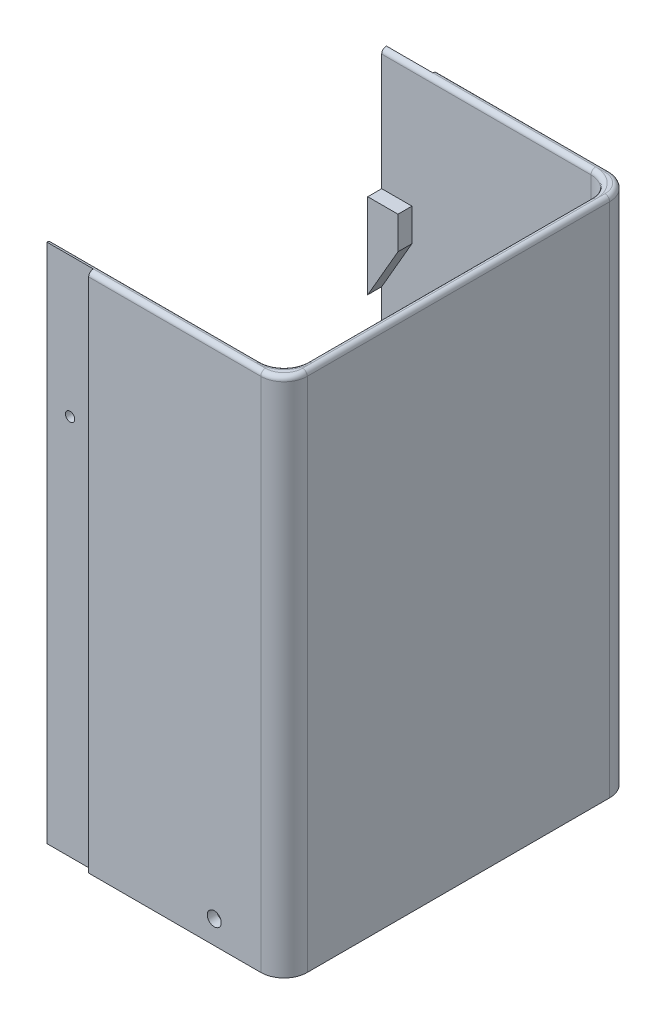
ISO-10303-21;
HEADER;
FILE_DESCRIPTION(('STEP AP214'),'2;1');
FILE_NAME('part.step','',(''),(''),'','','');
FILE_SCHEMA(('AUTOMOTIVE_DESIGN { 1 0 10303 214 1 1 1 1 }'));
ENDSEC;
DATA;
#1=APPLICATION_CONTEXT('core data for automotive mechanical design processes');
#2=APPLICATION_PROTOCOL_DEFINITION('international standard','automotive_design',2000,#1);
#3=PRODUCT_CONTEXT('',#1,'mechanical');
#4=PRODUCT('Part','Part','',(#3));
#5=PRODUCT_RELATED_PRODUCT_CATEGORY('part','',(#4));
#6=PRODUCT_DEFINITION_FORMATION('','',#4);
#7=PRODUCT_DEFINITION_CONTEXT('part definition',#1,'design');
#8=PRODUCT_DEFINITION('design','',#6,#7);
#9=PRODUCT_DEFINITION_SHAPE('','',#8);
#10=(LENGTH_UNIT() NAMED_UNIT(*) SI_UNIT(.MILLI.,.METRE.));
#11=(NAMED_UNIT(*) PLANE_ANGLE_UNIT() SI_UNIT($,.RADIAN.));
#12=(NAMED_UNIT(*) SI_UNIT($,.STERADIAN.) SOLID_ANGLE_UNIT());
#13=UNCERTAINTY_MEASURE_WITH_UNIT(LENGTH_MEASURE(1.E-05),#10,'distance_accuracy_value','');
#14=(GEOMETRIC_REPRESENTATION_CONTEXT(3) GLOBAL_UNCERTAINTY_ASSIGNED_CONTEXT((#13)) GLOBAL_UNIT_ASSIGNED_CONTEXT((#10,
#11,#12)) REPRESENTATION_CONTEXT('',''));
#15=CARTESIAN_POINT('',(0.,0.,0.));
#16=DIRECTION('',(0.,0.,1.));
#17=DIRECTION('',(1.,0.,0.));
#18=AXIS2_PLACEMENT_3D('',#15,#16,#17);
#19=CARTESIAN_POINT('',(-52.,12.,-35.5));
#20=DIRECTION('',(0.,0.,1.));
#21=DIRECTION('',(1.,0.,0.));
#22=AXIS2_PLACEMENT_3D('',#19,#20,#21);
#23=PLANE('',#22);
#24=CARTESIAN_POINT('',(37.,5.,-35.5));
#25=DIRECTION('',(0.,0.,1.));
#26=DIRECTION('',(1.,0.,0.));
#27=AXIS2_PLACEMENT_3D('',#24,#25,#26);
#28=CIRCLE('',#27,1.5);
#29=CARTESIAN_POINT('',(38.5,5.,-35.5));
#30=VERTEX_POINT('',#29);
#31=EDGE_CURVE('E380',#30,#30,#28,.T.);
#32=ORIENTED_EDGE('',*,*,#31,.F.);
#33=EDGE_LOOP('',(#32));
#34=FACE_BOUND('',#33,.T.);
#35=DIRECTION('',(0.,1.,0.));
#36=VECTOR('',#35,1.);
#37=CARTESIAN_POINT('',(6.49999999999999,85.937822173508,-35.5));
#38=LINE('',#37,#36);
#39=CARTESIAN_POINT('',(6.5,78.937822173508,-35.5));
#40=VERTEX_POINT('',#39);
#41=CARTESIAN_POINT('',(6.49999999999999,85.937822173508,-35.5));
#42=VERTEX_POINT('',#41);
#43=EDGE_CURVE('E306',#40,#42,#38,.T.);
#44=ORIENTED_EDGE('',*,*,#43,.F.);
#45=DIRECTION('',(0.500000000000025,0.866025403784424,0.));
#46=VECTOR('',#45,1.);
#47=CARTESIAN_POINT('',(6.5,78.937822173508,-35.5));
#48=LINE('',#47,#46);
#49=CARTESIAN_POINT('',(0.,67.679491924311,-35.5));
#50=VERTEX_POINT('',#49);
#51=EDGE_CURVE('E286',#50,#40,#48,.T.);
#52=ORIENTED_EDGE('',*,*,#51,.F.);
#53=DIRECTION('',(0.,1.,0.));
#54=VECTOR('',#53,1.);
#55=CARTESIAN_POINT('',(0.,112.,-35.5));
#56=LINE('',#55,#54);
#57=CARTESIAN_POINT('',(0.,0.,-35.5));
#58=VERTEX_POINT('',#57);
#59=EDGE_CURVE('E356',#58,#50,#56,.T.);
#60=ORIENTED_EDGE('',*,*,#59,.F.);
#61=DIRECTION('',(-1.,0.,0.));
#62=VECTOR('',#61,1.);
#63=CARTESIAN_POINT('',(-52.,0.,-35.5));
#64=LINE('',#63,#62);
#65=CARTESIAN_POINT('',(45.,0.,-35.5));
#66=VERTEX_POINT('',#65);
#67=EDGE_CURVE('E388',#66,#58,#64,.T.);
#68=ORIENTED_EDGE('',*,*,#67,.F.);
#69=DIRECTION('',(0.,-1.,0.));
#70=VECTOR('',#69,1.);
#71=CARTESIAN_POINT('',(44.9999999999999,112.,-35.5));
#72=LINE('',#71,#70);
#73=CARTESIAN_POINT('',(44.9999999999999,111.,-35.5));
#74=VERTEX_POINT('',#73);
#75=EDGE_CURVE('E429',#66,#74,#72,.F.);
#76=ORIENTED_EDGE('',*,*,#75,.T.);
#77=DIRECTION('',(1.,0.,0.));
#78=VECTOR('',#77,1.);
#79=CARTESIAN_POINT('',(-52.0000000000001,111.,-35.5));
#80=LINE('',#79,#78);
#81=CARTESIAN_POINT('',(0.,111.,-35.5));
#82=VERTEX_POINT('',#81);
#83=EDGE_CURVE('E488',#74,#82,#80,.F.);
#84=ORIENTED_EDGE('',*,*,#83,.T.);
#85=CARTESIAN_POINT('',(0.,85.937822173508,-35.5));
#86=VERTEX_POINT('',#85);
#87=EDGE_CURVE('E355',#86,#82,#56,.T.);
#88=ORIENTED_EDGE('',*,*,#87,.F.);
#89=DIRECTION('',(-1.,0.,0.));
#90=VECTOR('',#89,1.);
#91=CARTESIAN_POINT('',(0.,85.937822173508,-35.5));
#92=LINE('',#91,#90);
#93=EDGE_CURVE('E295',#42,#86,#92,.T.);
#94=ORIENTED_EDGE('',*,*,#93,.F.);
#95=EDGE_LOOP('',(#44,#52,#60,#68,#76,#84,#88,#94));
#96=FACE_BOUND('',#95,.T.);
#97=ADVANCED_FACE('F41',(#34,#96),#23,.T.);
#98=CARTESIAN_POINT('',(52.,112.,-37.5));
#99=DIRECTION('',(0.,1.,0.));
#100=DIRECTION('',(-1.,0.,0.));
#101=AXIS2_PLACEMENT_3D('',#98,#99,#100);
#102=PLANE('',#101);
#103=DIRECTION('',(0.,0.,1.));
#104=VECTOR('',#103,1.);
#105=CARTESIAN_POINT('',(50.9999999999999,112.,-32.5));
#106=LINE('',#105,#104);
#107=CARTESIAN_POINT('',(51.,112.,32.5));
#108=VERTEX_POINT('',#107);
#109=CARTESIAN_POINT('',(51.,112.,30.5));
#110=VERTEX_POINT('',#109);
#111=EDGE_CURVE('E475',#108,#110,#106,.F.);
#112=ORIENTED_EDGE('',*,*,#111,.T.);
#113=CARTESIAN_POINT('',(44.9999999999999,112.,30.5));
#114=DIRECTION('',(0.,1.,0.));
#115=DIRECTION('',(-1.,0.,0.));
#116=AXIS2_PLACEMENT_3D('',#113,#114,#115);
#117=CIRCLE('',#116,6.);
#118=CARTESIAN_POINT('',(44.9999999999999,112.,36.5));
#119=VERTEX_POINT('',#118);
#120=EDGE_CURVE('E484',#110,#119,#117,.F.);
#121=ORIENTED_EDGE('',*,*,#120,.T.);
#122=DIRECTION('',(-1.,0.,0.));
#123=VECTOR('',#122,1.);
#124=CARTESIAN_POINT('',(47.,112.,36.5));
#125=LINE('',#124,#123);
#126=CARTESIAN_POINT('',(47.,112.,36.5));
#127=VERTEX_POINT('',#126);
#128=EDGE_CURVE('E481',#119,#127,#125,.F.);
#129=ORIENTED_EDGE('',*,*,#128,.T.);
#130=CARTESIAN_POINT('',(47.,112.,32.5));
#131=DIRECTION('',(0.,1.,0.));
#132=DIRECTION('',(-1.,0.,0.));
#133=AXIS2_PLACEMENT_3D('',#130,#131,#132);
#134=CIRCLE('',#133,4.);
#135=EDGE_CURVE('E478',#127,#108,#134,.T.);
#136=ORIENTED_EDGE('',*,*,#135,.T.);
#137=EDGE_LOOP('',(#112,#121,#129,#136));
#138=FACE_BOUND('',#137,.T.);
#139=ADVANCED_FACE('F622',(#138),#102,.T.);
#140=CARTESIAN_POINT('',(10.,0.,0.));
#141=DIRECTION('',(1.,0.,0.));
#142=DIRECTION('',(0.,0.,-1.));
#143=AXIS2_PLACEMENT_3D('',#140,#141,#142);
#144=PLANE('',#143);
#145=DIRECTION('',(0.,-1.,0.));
#146=VECTOR('',#145,1.);
#147=CARTESIAN_POINT('',(10.,12.,37.5));
#148=LINE('',#147,#146);
#149=CARTESIAN_POINT('',(10.,111.,37.5));
#150=VERTEX_POINT('',#149);
#151=CARTESIAN_POINT('',(10.,0.,37.5));
#152=VERTEX_POINT('',#151);
#153=EDGE_CURVE('E415',#150,#152,#148,.T.);
#154=ORIENTED_EDGE('',*,*,#153,.F.);
#155=CARTESIAN_POINT('',(10.,111.,36.5));
#156=DIRECTION('',(1.,0.,0.));
#157=DIRECTION('',(0.,0.,-1.));
#158=AXIS2_PLACEMENT_3D('',#155,#156,#157);
#159=CIRCLE('',#158,1.);
#160=CARTESIAN_POINT('',(10.,112.,36.5));
#161=VERTEX_POINT('',#160);
#162=EDGE_CURVE('E513',#150,#161,#159,.F.);
#163=ORIENTED_EDGE('',*,*,#162,.T.);
#164=DIRECTION('',(0.,1.,0.));
#165=VECTOR('',#164,1.);
#166=CARTESIAN_POINT('',(10.,0.,36.5));
#167=LINE('',#166,#165);
#168=CARTESIAN_POINT('',(10.,0.,36.5));
#169=VERTEX_POINT('',#168);
#170=EDGE_CURVE('E329',#169,#161,#167,.T.);
#171=ORIENTED_EDGE('',*,*,#170,.F.);
#172=DIRECTION('',(0.,0.,-1.));
#173=VECTOR('',#172,1.);
#174=CARTESIAN_POINT('',(10.,0.,0.));
#175=LINE('',#174,#173);
#176=EDGE_CURVE('E411',#152,#169,#175,.T.);
#177=ORIENTED_EDGE('',*,*,#176,.F.);
#178=EDGE_LOOP('',(#154,#163,#171,#177));
#179=FACE_BOUND('',#178,.T.);
#180=ADVANCED_FACE('F582',(#179),#144,.F.);
#181=DIRECTION('',(0.,-1.,0.));
#182=VECTOR('',#181,1.);
#183=CARTESIAN_POINT('',(10.,112.,-36.5));
#184=LINE('',#183,#182);
#185=CARTESIAN_POINT('',(10.,112.,-36.5));
#186=VERTEX_POINT('',#185);
#187=CARTESIAN_POINT('',(10.,0.,-36.5));
#188=VERTEX_POINT('',#187);
#189=EDGE_CURVE('E346',#186,#188,#184,.T.);
#190=ORIENTED_EDGE('',*,*,#189,.F.);
#191=CARTESIAN_POINT('',(10.,111.,-36.5));
#192=DIRECTION('',(1.,0.,0.));
#193=DIRECTION('',(0.,0.,-1.));
#194=AXIS2_PLACEMENT_3D('',#191,#192,#193);
#195=CIRCLE('',#194,1.);
#196=CARTESIAN_POINT('',(10.,111.,-37.5));
#197=VERTEX_POINT('',#196);
#198=EDGE_CURVE('E51',#186,#197,#195,.F.);
#199=ORIENTED_EDGE('',*,*,#198,.T.);
#200=DIRECTION('',(0.,1.,0.));
#201=VECTOR('',#200,1.);
#202=CARTESIAN_POINT('',(10.,12.,-37.5));
#203=LINE('',#202,#201);
#204=CARTESIAN_POINT('',(9.99999999999999,0.,-37.5));
#205=VERTEX_POINT('',#204);
#206=EDGE_CURVE('E418',#205,#197,#203,.T.);
#207=ORIENTED_EDGE('',*,*,#206,.F.);
#208=EDGE_CURVE('E407',#188,#205,#175,.T.);
#209=ORIENTED_EDGE('',*,*,#208,.F.);
#210=EDGE_LOOP('',(#190,#199,#207,#209));
#211=FACE_BOUND('',#210,.T.);
#212=ADVANCED_FACE('F628',(#211),#144,.F.);
#213=CARTESIAN_POINT('',(51.9999999999999,12.,-37.5));
#214=DIRECTION('',(-1.,0.,0.));
#215=DIRECTION('',(0.,0.,1.));
#216=AXIS2_PLACEMENT_3D('',#213,#214,#215);
#217=PLANE('',#216);
#218=DIRECTION('',(0.,-1.,0.));
#219=VECTOR('',#218,1.);
#220=CARTESIAN_POINT('',(51.9999999999999,12.,-32.5));
#221=LINE('',#220,#219);
#222=CARTESIAN_POINT('',(51.9999999999999,0.,-32.5));
#223=VERTEX_POINT('',#222);
#224=CARTESIAN_POINT('',(51.9999999999999,111.,-32.5));
#225=VERTEX_POINT('',#224);
#226=EDGE_CURVE('E445',#223,#225,#221,.F.);
#227=ORIENTED_EDGE('',*,*,#226,.T.);
#228=DIRECTION('',(0.,0.,1.));
#229=VECTOR('',#228,1.);
#230=CARTESIAN_POINT('',(52.,111.,32.5));
#231=LINE('',#230,#229);
#232=CARTESIAN_POINT('',(52.,111.,32.5));
#233=VERTEX_POINT('',#232);
#234=EDGE_CURVE('E519',#225,#233,#231,.T.);
#235=ORIENTED_EDGE('',*,*,#234,.T.);
#236=DIRECTION('',(0.,-1.,0.));
#237=VECTOR('',#236,1.);
#238=CARTESIAN_POINT('',(52.,12.,32.5));
#239=LINE('',#238,#237);
#240=CARTESIAN_POINT('',(52.,0.,32.5));
#241=VERTEX_POINT('',#240);
#242=EDGE_CURVE('E442',#233,#241,#239,.T.);
#243=ORIENTED_EDGE('',*,*,#242,.T.);
#244=DIRECTION('',(0.,0.,-1.));
#245=VECTOR('',#244,1.);
#246=CARTESIAN_POINT('',(51.9999999999999,0.,-37.5));
#247=LINE('',#246,#245);
#248=EDGE_CURVE('E393',#241,#223,#247,.T.);
#249=ORIENTED_EDGE('',*,*,#248,.T.);
#250=EDGE_LOOP('',(#227,#235,#243,#249));
#251=FACE_BOUND('',#250,.T.);
#252=ADVANCED_FACE('F594',(#251),#217,.F.);
#253=CARTESIAN_POINT('',(-52.,12.,-37.5));
#254=DIRECTION('',(0.,0.,1.));
#255=DIRECTION('',(1.,0.,0.));
#256=AXIS2_PLACEMENT_3D('',#253,#254,#255);
#257=PLANE('',#256);
#258=CARTESIAN_POINT('',(37.,5.,-37.5));
#259=DIRECTION('',(0.,0.,1.));
#260=DIRECTION('',(1.,0.,0.));
#261=AXIS2_PLACEMENT_3D('',#258,#259,#260);
#262=CIRCLE('',#261,1.5);
#263=CARTESIAN_POINT('',(38.5,5.,-37.5));
#264=VERTEX_POINT('',#263);
#265=EDGE_CURVE('E372',#264,#264,#262,.T.);
#266=ORIENTED_EDGE('',*,*,#265,.T.);
#267=EDGE_LOOP('',(#266));
#268=FACE_BOUND('',#267,.T.);
#269=ORIENTED_EDGE('',*,*,#206,.T.);
#270=DIRECTION('',(-1.,0.,0.));
#271=VECTOR('',#270,1.);
#272=CARTESIAN_POINT('',(47.,111.,-37.5));
#273=LINE('',#272,#271);
#274=CARTESIAN_POINT('',(47.,111.,-37.5));
#275=VERTEX_POINT('',#274);
#276=EDGE_CURVE('E11',#197,#275,#273,.F.);
#277=ORIENTED_EDGE('',*,*,#276,.T.);
#278=DIRECTION('',(0.,-1.,0.));
#279=VECTOR('',#278,1.);
#280=CARTESIAN_POINT('',(47.,12.,-37.5));
#281=LINE('',#280,#279);
#282=CARTESIAN_POINT('',(46.9999999999999,0.,-37.5));
#283=VERTEX_POINT('',#282);
#284=EDGE_CURVE('E433',#275,#283,#281,.T.);
#285=ORIENTED_EDGE('',*,*,#284,.T.);
#286=DIRECTION('',(-1.,0.,0.));
#287=VECTOR('',#286,1.);
#288=CARTESIAN_POINT('',(-52.,0.,-37.5));
#289=LINE('',#288,#287);
#290=EDGE_CURVE('E399',#283,#205,#289,.T.);
#291=ORIENTED_EDGE('',*,*,#290,.T.);
#292=EDGE_LOOP('',(#269,#277,#285,#291));
#293=FACE_BOUND('',#292,.T.);
#294=ADVANCED_FACE('F646',(#268,#293),#257,.F.);
#295=CARTESIAN_POINT('',(-52.,12.,37.5));
#296=DIRECTION('',(0.,0.,-1.));
#297=DIRECTION('',(-1.,0.,0.));
#298=AXIS2_PLACEMENT_3D('',#295,#296,#297);
#299=PLANE('',#298);
#300=CARTESIAN_POINT('',(37.,5.,37.5));
#301=DIRECTION('',(0.,0.,1.));
#302=DIRECTION('',(1.,0.,0.));
#303=AXIS2_PLACEMENT_3D('',#300,#301,#302);
#304=CIRCLE('',#303,1.5);
#305=CARTESIAN_POINT('',(38.5,5.,37.5));
#306=VERTEX_POINT('',#305);
#307=EDGE_CURVE('E371',#306,#306,#304,.T.);
#308=ORIENTED_EDGE('',*,*,#307,.F.);
#309=EDGE_LOOP('',(#308));
#310=FACE_BOUND('',#309,.T.);
#311=DIRECTION('',(0.,-1.,0.));
#312=VECTOR('',#311,1.);
#313=CARTESIAN_POINT('',(47.,12.,37.5));
#314=LINE('',#313,#312);
#315=CARTESIAN_POINT('',(47.,0.,37.5));
#316=VERTEX_POINT('',#315);
#317=CARTESIAN_POINT('',(47.,111.,37.5));
#318=VERTEX_POINT('',#317);
#319=EDGE_CURVE('E449',#316,#318,#314,.F.);
#320=ORIENTED_EDGE('',*,*,#319,.T.);
#321=DIRECTION('',(-1.,0.,0.));
#322=VECTOR('',#321,1.);
#323=CARTESIAN_POINT('',(10.,111.,37.5));
#324=LINE('',#323,#322);
#325=EDGE_CURVE('E510',#318,#150,#324,.T.);
#326=ORIENTED_EDGE('',*,*,#325,.T.);
#327=ORIENTED_EDGE('',*,*,#153,.T.);
#328=DIRECTION('',(1.,0.,0.));
#329=VECTOR('',#328,1.);
#330=CARTESIAN_POINT('',(-52.,0.,37.5));
#331=LINE('',#330,#329);
#332=EDGE_CURVE('E403',#152,#316,#331,.T.);
#333=ORIENTED_EDGE('',*,*,#332,.T.);
#334=EDGE_LOOP('',(#320,#326,#327,#333));
#335=FACE_BOUND('',#334,.T.);
#336=ADVANCED_FACE('F578',(#310,#335),#299,.F.);
#337=CARTESIAN_POINT('',(0.,0.,0.));
#338=DIRECTION('',(0.,1.,0.));
#339=DIRECTION('',(0.,0.,1.));
#340=AXIS2_PLACEMENT_3D('',#337,#338,#339);
#341=PLANE('',#340);
#342=ORIENTED_EDGE('',*,*,#290,.F.);
#343=CARTESIAN_POINT('',(47.,0.,-32.5));
#344=DIRECTION('',(0.,1.,0.));
#345=DIRECTION('',(0.,0.,1.));
#346=AXIS2_PLACEMENT_3D('',#343,#344,#345);
#347=CIRCLE('',#346,5.);
#348=EDGE_CURVE('E439',#283,#223,#347,.F.);
#349=ORIENTED_EDGE('',*,*,#348,.T.);
#350=ORIENTED_EDGE('',*,*,#248,.F.);
#351=CARTESIAN_POINT('',(47.,0.,32.5));
#352=DIRECTION('',(0.,1.,0.));
#353=DIRECTION('',(0.,0.,1.));
#354=AXIS2_PLACEMENT_3D('',#351,#352,#353);
#355=CIRCLE('',#354,5.);
#356=EDGE_CURVE('E436',#241,#316,#355,.F.);
#357=ORIENTED_EDGE('',*,*,#356,.T.);
#358=ORIENTED_EDGE('',*,*,#332,.F.);
#359=ORIENTED_EDGE('',*,*,#176,.T.);
#360=DIRECTION('',(1.,0.,0.));
#361=VECTOR('',#360,1.);
#362=CARTESIAN_POINT('',(0.,0.,36.5));
#363=LINE('',#362,#361);
#364=CARTESIAN_POINT('',(0.,0.,36.5));
#365=VERTEX_POINT('',#364);
#366=EDGE_CURVE('E335',#365,#169,#363,.T.);
#367=ORIENTED_EDGE('',*,*,#366,.F.);
#368=DIRECTION('',(0.,0.,1.));
#369=VECTOR('',#368,1.);
#370=CARTESIAN_POINT('',(0.,0.,36.5));
#371=LINE('',#370,#369);
#372=CARTESIAN_POINT('',(0.,0.,35.5));
#373=VERTEX_POINT('',#372);
#374=EDGE_CURVE('E332',#373,#365,#371,.T.);
#375=ORIENTED_EDGE('',*,*,#374,.F.);
#376=DIRECTION('',(1.,0.,0.));
#377=VECTOR('',#376,1.);
#378=CARTESIAN_POINT('',(-52.,0.,35.5));
#379=LINE('',#378,#377);
#380=CARTESIAN_POINT('',(44.9999999999999,0.,35.5));
#381=VERTEX_POINT('',#380);
#382=EDGE_CURVE('E389',#373,#381,#379,.T.);
#383=ORIENTED_EDGE('',*,*,#382,.T.);
#384=CARTESIAN_POINT('',(44.9999999999999,0.,30.5));
#385=DIRECTION('',(0.,1.,0.));
#386=DIRECTION('',(0.,0.,1.));
#387=AXIS2_PLACEMENT_3D('',#384,#385,#386);
#388=CIRCLE('',#387,5.);
#389=CARTESIAN_POINT('',(50.,0.,30.5));
#390=VERTEX_POINT('',#389);
#391=EDGE_CURVE('E459',#381,#390,#388,.T.);
#392=ORIENTED_EDGE('',*,*,#391,.T.);
#393=DIRECTION('',(0.,0.,-1.));
#394=VECTOR('',#393,1.);
#395=CARTESIAN_POINT('',(49.9999999999999,0.,-37.5));
#396=LINE('',#395,#394);
#397=CARTESIAN_POINT('',(49.9999999999999,0.,-30.5));
#398=VERTEX_POINT('',#397);
#399=EDGE_CURVE('E384',#390,#398,#396,.T.);
#400=ORIENTED_EDGE('',*,*,#399,.T.);
#401=CARTESIAN_POINT('',(44.9999999999999,0.,-30.5));
#402=DIRECTION('',(0.,1.,0.));
#403=DIRECTION('',(0.,0.,1.));
#404=AXIS2_PLACEMENT_3D('',#401,#402,#403);
#405=CIRCLE('',#404,5.);
#406=EDGE_CURVE('E456',#398,#66,#405,.T.);
#407=ORIENTED_EDGE('',*,*,#406,.T.);
#408=ORIENTED_EDGE('',*,*,#67,.T.);
#409=DIRECTION('',(0.,0.,1.));
#410=VECTOR('',#409,1.);
#411=CARTESIAN_POINT('',(0.,0.,-36.5));
#412=LINE('',#411,#410);
#413=CARTESIAN_POINT('',(0.,0.,-36.5));
#414=VERTEX_POINT('',#413);
#415=EDGE_CURVE('E351',#414,#58,#412,.T.);
#416=ORIENTED_EDGE('',*,*,#415,.F.);
#417=DIRECTION('',(1.,0.,0.));
#418=VECTOR('',#417,1.);
#419=CARTESIAN_POINT('',(0.,0.,-36.5));
#420=LINE('',#419,#418);
#421=EDGE_CURVE('E367',#414,#188,#420,.T.);
#422=ORIENTED_EDGE('',*,*,#421,.T.);
#423=ORIENTED_EDGE('',*,*,#208,.T.);
#424=EDGE_LOOP('',(#342,#349,#350,#357,#358,#359,#367,#375,#383,#392,#400,#407,#408,#416,#422,#423));
#425=FACE_BOUND('',#424,.T.);
#426=ADVANCED_FACE('F587',(#425),#341,.F.);
#427=DIRECTION('',(-1.,0.,0.));
#428=VECTOR('',#427,1.);
#429=CARTESIAN_POINT('',(10.,112.,-36.5));
#430=LINE('',#429,#428);
#431=CARTESIAN_POINT('',(47.,112.,-36.5));
#432=VERTEX_POINT('',#431);
#433=CARTESIAN_POINT('',(44.9999999999999,112.,-36.5));
#434=VERTEX_POINT('',#433);
#435=EDGE_CURVE('E462',#432,#434,#430,.T.);
#436=ORIENTED_EDGE('',*,*,#435,.T.);
#437=CARTESIAN_POINT('',(44.9999999999999,112.,-30.5));
#438=DIRECTION('',(0.,1.,0.));
#439=DIRECTION('',(-1.,0.,0.));
#440=AXIS2_PLACEMENT_3D('',#437,#438,#439);
#441=CIRCLE('',#440,6.);
#442=CARTESIAN_POINT('',(50.9999999999999,112.,-30.5));
#443=VERTEX_POINT('',#442);
#444=EDGE_CURVE('E471',#434,#443,#441,.F.);
#445=ORIENTED_EDGE('',*,*,#444,.T.);
#446=DIRECTION('',(0.,0.,1.));
#447=VECTOR('',#446,1.);
#448=CARTESIAN_POINT('',(50.9999999999999,112.,-32.5));
#449=LINE('',#448,#447);
#450=CARTESIAN_POINT('',(51.,112.,-32.5));
#451=VERTEX_POINT('',#450);
#452=EDGE_CURVE('E468',#443,#451,#449,.F.);
#453=ORIENTED_EDGE('',*,*,#452,.T.);
#454=CARTESIAN_POINT('',(47.,112.,-32.5));
#455=DIRECTION('',(0.,1.,0.));
#456=DIRECTION('',(-1.,0.,0.));
#457=AXIS2_PLACEMENT_3D('',#454,#455,#456);
#458=CIRCLE('',#457,4.);
#459=EDGE_CURVE('E465',#451,#432,#458,.T.);
#460=ORIENTED_EDGE('',*,*,#459,.T.);
#461=EDGE_LOOP('',(#436,#445,#453,#460));
#462=FACE_BOUND('',#461,.T.);
#463=ADVANCED_FACE('F609',(#462),#102,.T.);
#464=CARTESIAN_POINT('',(49.9999999999999,12.,-37.5));
#465=DIRECTION('',(-1.,0.,0.));
#466=DIRECTION('',(0.,0.,1.));
#467=AXIS2_PLACEMENT_3D('',#464,#465,#466);
#468=PLANE('',#467);
#469=DIRECTION('',(0.,-1.,0.));
#470=VECTOR('',#469,1.);
#471=CARTESIAN_POINT('',(50.,112.,30.5));
#472=LINE('',#471,#470);
#473=CARTESIAN_POINT('',(50.,111.,30.5));
#474=VERTEX_POINT('',#473);
#475=EDGE_CURVE('E422',#390,#474,#472,.F.);
#476=ORIENTED_EDGE('',*,*,#475,.T.);
#477=DIRECTION('',(0.,0.,1.));
#478=VECTOR('',#477,1.);
#479=CARTESIAN_POINT('',(49.9999999999999,111.,-37.5));
#480=LINE('',#479,#478);
#481=CARTESIAN_POINT('',(49.9999999999999,111.,-30.5));
#482=VERTEX_POINT('',#481);
#483=EDGE_CURVE('E498',#474,#482,#480,.F.);
#484=ORIENTED_EDGE('',*,*,#483,.T.);
#485=DIRECTION('',(0.,-1.,0.));
#486=VECTOR('',#485,1.);
#487=CARTESIAN_POINT('',(49.9999999999999,0.,-30.5));
#488=LINE('',#487,#486);
#489=EDGE_CURVE('E426',#482,#398,#488,.T.);
#490=ORIENTED_EDGE('',*,*,#489,.T.);
#491=ORIENTED_EDGE('',*,*,#399,.F.);
#492=EDGE_LOOP('',(#476,#484,#490,#491));
#493=FACE_BOUND('',#492,.T.);
#494=ADVANCED_FACE('F636',(#493),#468,.T.);
#495=CARTESIAN_POINT('',(-52.,12.,35.5));
#496=DIRECTION('',(0.,0.,-1.));
#497=DIRECTION('',(-1.,0.,0.));
#498=AXIS2_PLACEMENT_3D('',#495,#496,#497);
#499=PLANE('',#498);
#500=DIRECTION('',(-1.,0.,0.));
#501=VECTOR('',#500,1.);
#502=CARTESIAN_POINT('',(0.,85.937822173508,35.5));
#503=LINE('',#502,#501);
#504=CARTESIAN_POINT('',(6.49999999999999,85.937822173508,35.5));
#505=VERTEX_POINT('',#504);
#506=CARTESIAN_POINT('',(0.,85.937822173508,35.5));
#507=VERTEX_POINT('',#506);
#508=EDGE_CURVE('E265',#505,#507,#503,.T.);
#509=ORIENTED_EDGE('',*,*,#508,.T.);
#510=DIRECTION('',(0.,-1.,0.));
#511=VECTOR('',#510,1.);
#512=CARTESIAN_POINT('',(0.,0.,35.5));
#513=LINE('',#512,#511);
#514=CARTESIAN_POINT('',(0.,111.,35.5));
#515=VERTEX_POINT('',#514);
#516=EDGE_CURVE('E235',#515,#507,#513,.T.);
#517=ORIENTED_EDGE('',*,*,#516,.F.);
#518=DIRECTION('',(-1.,0.,0.));
#519=VECTOR('',#518,1.);
#520=CARTESIAN_POINT('',(-52.0000000000001,111.,35.5));
#521=LINE('',#520,#519);
#522=CARTESIAN_POINT('',(44.9999999999999,111.,35.5));
#523=VERTEX_POINT('',#522);
#524=EDGE_CURVE('E507',#515,#523,#521,.F.);
#525=ORIENTED_EDGE('',*,*,#524,.T.);
#526=DIRECTION('',(0.,-1.,0.));
#527=VECTOR('',#526,1.);
#528=CARTESIAN_POINT('',(44.9999999999999,0.,35.5));
#529=LINE('',#528,#527);
#530=EDGE_CURVE('E453',#523,#381,#529,.T.);
#531=ORIENTED_EDGE('',*,*,#530,.T.);
#532=ORIENTED_EDGE('',*,*,#382,.F.);
#533=CARTESIAN_POINT('',(0.,67.679491924311,35.5));
#534=VERTEX_POINT('',#533);
#535=EDGE_CURVE('E328',#534,#373,#513,.T.);
#536=ORIENTED_EDGE('',*,*,#535,.F.);
#537=DIRECTION('',(0.500000000000025,0.866025403784424,0.));
#538=VECTOR('',#537,1.);
#539=CARTESIAN_POINT('',(6.5,78.937822173508,35.5));
#540=LINE('',#539,#538);
#541=CARTESIAN_POINT('',(6.5,78.937822173508,35.5));
#542=VERTEX_POINT('',#541);
#543=EDGE_CURVE('E59',#534,#542,#540,.T.);
#544=ORIENTED_EDGE('',*,*,#543,.T.);
#545=DIRECTION('',(0.,1.,0.));
#546=VECTOR('',#545,1.);
#547=CARTESIAN_POINT('',(6.49999999999999,85.937822173508,35.5));
#548=LINE('',#547,#546);
#549=EDGE_CURVE('E268',#542,#505,#548,.T.);
#550=ORIENTED_EDGE('',*,*,#549,.T.);
#551=EDGE_LOOP('',(#509,#517,#525,#531,#532,#536,#544,#550));
#552=FACE_BOUND('',#551,.T.);
#553=CARTESIAN_POINT('',(37.,5.,35.5));
#554=DIRECTION('',(0.,0.,-1.));
#555=DIRECTION('',(-1.,0.,0.));
#556=AXIS2_PLACEMENT_3D('',#553,#554,#555);
#557=CIRCLE('',#556,1.5);
#558=CARTESIAN_POINT('',(35.5,5.,35.5));
#559=VERTEX_POINT('',#558);
#560=EDGE_CURVE('E376',#559,#559,#557,.T.);
#561=ORIENTED_EDGE('',*,*,#560,.F.);
#562=EDGE_LOOP('',(#561));
#563=FACE_BOUND('',#562,.T.);
#564=ADVANCED_FACE('F641',(#552,#563),#499,.T.);
#565=CARTESIAN_POINT('',(37.,5.,-37.5));
#566=DIRECTION('',(0.,0.,1.));
#567=DIRECTION('',(1.,0.,0.));
#568=AXIS2_PLACEMENT_3D('',#565,#566,#567);
#569=CYLINDRICAL_SURFACE('',#568,1.5);
#570=ORIENTED_EDGE('',*,*,#560,.T.);
#571=EDGE_LOOP('',(#570));
#572=FACE_BOUND('',#571,.T.);
#573=ORIENTED_EDGE('',*,*,#307,.T.);
#574=EDGE_LOOP('',(#573));
#575=FACE_BOUND('',#574,.T.);
#576=ADVANCED_FACE('F721',(#572,#575),#569,.F.);
#577=ORIENTED_EDGE('',*,*,#31,.T.);
#578=EDGE_LOOP('',(#577));
#579=FACE_BOUND('',#578,.T.);
#580=ORIENTED_EDGE('',*,*,#265,.F.);
#581=EDGE_LOOP('',(#580));
#582=FACE_BOUND('',#581,.T.);
#583=ADVANCED_FACE('F658',(#579,#582),#569,.F.);
#584=CARTESIAN_POINT('',(44.9999999999999,12.,-30.5));
#585=DIRECTION('',(0.,1.,0.));
#586=DIRECTION('',(0.,0.,1.));
#587=AXIS2_PLACEMENT_3D('',#584,#585,#586);
#588=CYLINDRICAL_SURFACE('',#587,5.);
#589=ORIENTED_EDGE('',*,*,#489,.F.);
#590=CARTESIAN_POINT('',(44.9999999999999,111.,-30.5));
#591=DIRECTION('',(0.,1.,0.));
#592=DIRECTION('',(-1.,0.,0.));
#593=AXIS2_PLACEMENT_3D('',#590,#591,#592);
#594=CIRCLE('',#593,5.);
#595=EDGE_CURVE('E495',#482,#74,#594,.T.);
#596=ORIENTED_EDGE('',*,*,#595,.T.);
#597=ORIENTED_EDGE('',*,*,#75,.F.);
#598=ORIENTED_EDGE('',*,*,#406,.F.);
#599=EDGE_LOOP('',(#589,#596,#597,#598));
#600=FACE_BOUND('',#599,.T.);
#601=ADVANCED_FACE('F654',(#600),#588,.F.);
#602=CARTESIAN_POINT('',(47.,12.,-32.5));
#603=DIRECTION('',(0.,-1.,0.));
#604=DIRECTION('',(0.,0.,-1.));
#605=AXIS2_PLACEMENT_3D('',#602,#603,#604);
#606=CYLINDRICAL_SURFACE('',#605,5.);
#607=ORIENTED_EDGE('',*,*,#284,.F.);
#608=CARTESIAN_POINT('',(47.,111.,-32.5));
#609=DIRECTION('',(0.,1.,0.));
#610=DIRECTION('',(-1.,0.,0.));
#611=AXIS2_PLACEMENT_3D('',#608,#609,#610);
#612=CIRCLE('',#611,5.);
#613=EDGE_CURVE('E522',#275,#225,#612,.F.);
#614=ORIENTED_EDGE('',*,*,#613,.T.);
#615=ORIENTED_EDGE('',*,*,#226,.F.);
#616=ORIENTED_EDGE('',*,*,#348,.F.);
#617=EDGE_LOOP('',(#607,#614,#615,#616));
#618=FACE_BOUND('',#617,.T.);
#619=ADVANCED_FACE('F661',(#618),#606,.T.);
#620=CARTESIAN_POINT('',(47.,12.,32.5));
#621=DIRECTION('',(0.,-1.,0.));
#622=DIRECTION('',(0.,0.,-1.));
#623=AXIS2_PLACEMENT_3D('',#620,#621,#622);
#624=CYLINDRICAL_SURFACE('',#623,5.);
#625=ORIENTED_EDGE('',*,*,#242,.F.);
#626=CARTESIAN_POINT('',(47.,111.,32.5));
#627=DIRECTION('',(0.,1.,0.));
#628=DIRECTION('',(-1.,0.,0.));
#629=AXIS2_PLACEMENT_3D('',#626,#627,#628);
#630=CIRCLE('',#629,5.);
#631=EDGE_CURVE('E516',#233,#318,#630,.F.);
#632=ORIENTED_EDGE('',*,*,#631,.T.);
#633=ORIENTED_EDGE('',*,*,#319,.F.);
#634=ORIENTED_EDGE('',*,*,#356,.F.);
#635=EDGE_LOOP('',(#625,#632,#633,#634));
#636=FACE_BOUND('',#635,.T.);
#637=ADVANCED_FACE('F592',(#636),#624,.T.);
#638=CARTESIAN_POINT('',(44.9999999999999,12.,30.5));
#639=DIRECTION('',(0.,1.,0.));
#640=DIRECTION('',(0.,0.,1.));
#641=AXIS2_PLACEMENT_3D('',#638,#639,#640);
#642=CYLINDRICAL_SURFACE('',#641,5.);
#643=ORIENTED_EDGE('',*,*,#530,.F.);
#644=CARTESIAN_POINT('',(44.9999999999999,111.,30.5));
#645=DIRECTION('',(0.,1.,0.));
#646=DIRECTION('',(-1.,0.,0.));
#647=AXIS2_PLACEMENT_3D('',#644,#645,#646);
#648=CIRCLE('',#647,5.);
#649=EDGE_CURVE('E501',#523,#474,#648,.T.);
#650=ORIENTED_EDGE('',*,*,#649,.T.);
#651=ORIENTED_EDGE('',*,*,#475,.F.);
#652=ORIENTED_EDGE('',*,*,#391,.F.);
#653=EDGE_LOOP('',(#643,#650,#651,#652));
#654=FACE_BOUND('',#653,.T.);
#655=ADVANCED_FACE('F668',(#654),#642,.F.);
#656=CARTESIAN_POINT('',(0.,112.,-36.5));
#657=DIRECTION('',(0.,0.,1.));
#658=DIRECTION('',(1.,0.,0.));
#659=AXIS2_PLACEMENT_3D('',#656,#657,#658);
#660=PLANE('',#659);
#661=CARTESIAN_POINT('',(4.99999999999997,82.,-36.5));
#662=DIRECTION('',(0.,0.,-1.));
#663=DIRECTION('',(-1.,0.,0.));
#664=AXIS2_PLACEMENT_3D('',#661,#662,#663);
#665=CIRCLE('',#664,1.);
#666=CARTESIAN_POINT('',(3.99999999999996,82.,-36.5));
#667=VERTEX_POINT('',#666);
#668=EDGE_CURVE('E241',#667,#667,#665,.T.);
#669=ORIENTED_EDGE('',*,*,#668,.F.);
#670=EDGE_LOOP('',(#669));
#671=FACE_BOUND('',#670,.T.);
#672=ORIENTED_EDGE('',*,*,#189,.T.);
#673=ORIENTED_EDGE('',*,*,#421,.F.);
#674=DIRECTION('',(0.,-1.,0.));
#675=VECTOR('',#674,1.);
#676=CARTESIAN_POINT('',(0.,112.,-36.5));
#677=LINE('',#676,#675);
#678=CARTESIAN_POINT('',(0.,112.,-36.5));
#679=VERTEX_POINT('',#678);
#680=EDGE_CURVE('E347',#679,#414,#677,.T.);
#681=ORIENTED_EDGE('',*,*,#680,.F.);
#682=DIRECTION('',(1.,0.,0.));
#683=VECTOR('',#682,1.);
#684=CARTESIAN_POINT('',(0.,112.,-36.5));
#685=LINE('',#684,#683);
#686=EDGE_CURVE('E360',#679,#186,#685,.T.);
#687=ORIENTED_EDGE('',*,*,#686,.T.);
#688=EDGE_LOOP('',(#672,#673,#681,#687));
#689=FACE_BOUND('',#688,.T.);
#690=ADVANCED_FACE('F671',(#671,#689),#660,.F.);
#691=CARTESIAN_POINT('',(0.,0.,0.));
#692=DIRECTION('',(-1.,0.,0.));
#693=DIRECTION('',(0.,0.,1.));
#694=AXIS2_PLACEMENT_3D('',#691,#692,#693);
#695=PLANE('',#694);
#696=ORIENTED_EDGE('',*,*,#59,.T.);
#697=DIRECTION('',(0.,0.,-1.));
#698=VECTOR('',#697,1.);
#699=CARTESIAN_POINT('',(0.,67.679491924311,-32.5));
#700=LINE('',#699,#698);
#701=CARTESIAN_POINT('',(0.,67.679491924311,-32.5));
#702=VERTEX_POINT('',#701);
#703=EDGE_CURVE('E321',#702,#50,#700,.T.);
#704=ORIENTED_EDGE('',*,*,#703,.F.);
#705=DIRECTION('',(0.,-1.,0.));
#706=VECTOR('',#705,1.);
#707=CARTESIAN_POINT('',(0.,67.679491924311,-32.5));
#708=LINE('',#707,#706);
#709=CARTESIAN_POINT('',(0.,85.937822173508,-32.5));
#710=VERTEX_POINT('',#709);
#711=EDGE_CURVE('E290',#710,#702,#708,.T.);
#712=ORIENTED_EDGE('',*,*,#711,.F.);
#713=DIRECTION('',(0.,0.,-1.));
#714=VECTOR('',#713,1.);
#715=CARTESIAN_POINT('',(0.,85.937822173508,-32.5));
#716=LINE('',#715,#714);
#717=EDGE_CURVE('E67',#710,#86,#716,.T.);
#718=ORIENTED_EDGE('',*,*,#717,.T.);
#719=ORIENTED_EDGE('',*,*,#87,.T.);
#720=CARTESIAN_POINT('',(0.,111.,-36.5));
#721=DIRECTION('',(-1.,0.,0.));
#722=DIRECTION('',(0.,0.,1.));
#723=AXIS2_PLACEMENT_3D('',#720,#721,#722);
#724=CIRCLE('',#723,1.);
#725=EDGE_CURVE('E492',#82,#679,#724,.T.);
#726=ORIENTED_EDGE('',*,*,#725,.T.);
#727=ORIENTED_EDGE('',*,*,#680,.T.);
#728=ORIENTED_EDGE('',*,*,#415,.T.);
#729=EDGE_LOOP('',(#696,#704,#712,#718,#719,#726,#727,#728));
#730=FACE_BOUND('',#729,.T.);
#731=ADVANCED_FACE('F711',(#730),#695,.T.);
#732=CARTESIAN_POINT('',(0.,0.,36.5));
#733=DIRECTION('',(0.,0.,-1.));
#734=DIRECTION('',(-1.,0.,0.));
#735=AXIS2_PLACEMENT_3D('',#732,#733,#734);
#736=PLANE('',#735);
#737=CARTESIAN_POINT('',(4.99999999999997,82.,36.5));
#738=DIRECTION('',(0.,0.,-1.));
#739=DIRECTION('',(-1.,0.,0.));
#740=AXIS2_PLACEMENT_3D('',#737,#738,#739);
#741=CIRCLE('',#740,1.);
#742=CARTESIAN_POINT('',(3.99999999999996,82.,36.5));
#743=VERTEX_POINT('',#742);
#744=EDGE_CURVE('E1119',#743,#743,#741,.T.);
#745=ORIENTED_EDGE('',*,*,#744,.T.);
#746=EDGE_LOOP('',(#745));
#747=FACE_BOUND('',#746,.T.);
#748=ORIENTED_EDGE('',*,*,#170,.T.);
#749=DIRECTION('',(1.,0.,0.));
#750=VECTOR('',#749,1.);
#751=CARTESIAN_POINT('',(0.,112.,36.5));
#752=LINE('',#751,#750);
#753=CARTESIAN_POINT('',(0.,112.,36.5));
#754=VERTEX_POINT('',#753);
#755=EDGE_CURVE('E342',#754,#161,#752,.T.);
#756=ORIENTED_EDGE('',*,*,#755,.F.);
#757=DIRECTION('',(0.,1.,0.));
#758=VECTOR('',#757,1.);
#759=CARTESIAN_POINT('',(0.,0.,36.5));
#760=LINE('',#759,#758);
#761=EDGE_CURVE('E325',#365,#754,#760,.T.);
#762=ORIENTED_EDGE('',*,*,#761,.F.);
#763=ORIENTED_EDGE('',*,*,#366,.T.);
#764=EDGE_LOOP('',(#748,#756,#762,#763));
#765=FACE_BOUND('',#764,.T.);
#766=ADVANCED_FACE('F704',(#747,#765),#736,.F.);
#767=CARTESIAN_POINT('',(0.,0.,0.));
#768=DIRECTION('',(-1.,0.,0.));
#769=DIRECTION('',(0.,0.,1.));
#770=AXIS2_PLACEMENT_3D('',#767,#768,#769);
#771=PLANE('',#770);
#772=ORIENTED_EDGE('',*,*,#761,.T.);
#773=CARTESIAN_POINT('',(0.,111.,36.5));
#774=DIRECTION('',(-1.,0.,0.));
#775=DIRECTION('',(0.,0.,1.));
#776=AXIS2_PLACEMENT_3D('',#773,#774,#775);
#777=CIRCLE('',#776,1.);
#778=EDGE_CURVE('E504',#754,#515,#777,.T.);
#779=ORIENTED_EDGE('',*,*,#778,.T.);
#780=ORIENTED_EDGE('',*,*,#516,.T.);
#781=DIRECTION('',(0.,0.,1.));
#782=VECTOR('',#781,1.);
#783=CARTESIAN_POINT('',(0.,85.937822173508,32.5));
#784=LINE('',#783,#782);
#785=CARTESIAN_POINT('',(0.,85.937822173508,32.5));
#786=VERTEX_POINT('',#785);
#787=EDGE_CURVE('E229',#786,#507,#784,.T.);
#788=ORIENTED_EDGE('',*,*,#787,.F.);
#789=DIRECTION('',(0.,-1.,0.));
#790=VECTOR('',#789,1.);
#791=CARTESIAN_POINT('',(0.,67.679491924311,32.5));
#792=LINE('',#791,#790);
#793=CARTESIAN_POINT('',(0.,67.679491924311,32.5));
#794=VERTEX_POINT('',#793);
#795=EDGE_CURVE('E232',#786,#794,#792,.T.);
#796=ORIENTED_EDGE('',*,*,#795,.T.);
#797=DIRECTION('',(0.,0.,1.));
#798=VECTOR('',#797,1.);
#799=CARTESIAN_POINT('',(0.,67.679491924311,32.5));
#800=LINE('',#799,#798);
#801=EDGE_CURVE('E264',#794,#534,#800,.T.);
#802=ORIENTED_EDGE('',*,*,#801,.T.);
#803=ORIENTED_EDGE('',*,*,#535,.T.);
#804=ORIENTED_EDGE('',*,*,#374,.T.);
#805=EDGE_LOOP('',(#772,#779,#780,#788,#796,#802,#803,#804));
#806=FACE_BOUND('',#805,.T.);
#807=ADVANCED_FACE('F231',(#806),#771,.T.);
#808=CARTESIAN_POINT('',(-52.0000000000001,111.,36.5));
#809=DIRECTION('',(1.,0.,0.));
#810=DIRECTION('',(0.,1.,0.));
#811=AXIS2_PLACEMENT_3D('',#808,#809,#810);
#812=CYLINDRICAL_SURFACE('',#811,1.);
#813=ORIENTED_EDGE('',*,*,#162,.F.);
#814=ORIENTED_EDGE('',*,*,#325,.F.);
#815=CARTESIAN_POINT('',(47.,111.,36.5));
#816=DIRECTION('',(1.,0.,0.));
#817=DIRECTION('',(0.,0.,-1.));
#818=AXIS2_PLACEMENT_3D('',#815,#816,#817);
#819=CIRCLE('',#818,1.);
#820=EDGE_CURVE('E45',#127,#318,#819,.T.);
#821=ORIENTED_EDGE('',*,*,#820,.F.);
#822=ORIENTED_EDGE('',*,*,#128,.F.);
#823=DIRECTION('',(-1.,0.,0.));
#824=VECTOR('',#823,1.);
#825=CARTESIAN_POINT('',(47.,112.,36.5));
#826=LINE('',#825,#824);
#827=EDGE_CURVE('E558',#161,#119,#826,.F.);
#828=ORIENTED_EDGE('',*,*,#827,.F.);
#829=EDGE_LOOP('',(#813,#814,#821,#822,#828));
#830=FACE_BOUND('',#829,.T.);
#831=ADVANCED_FACE('F43',(#830),#812,.T.);
#832=CARTESIAN_POINT('',(47.,111.,32.5));
#833=DIRECTION('',(0.,1.,0.));
#834=DIRECTION('',(-1.,0.,0.));
#835=AXIS2_PLACEMENT_3D('',#832,#833,#834);
#836=TOROIDAL_SURFACE('',#835,4.,1.);
#837=ORIENTED_EDGE('',*,*,#820,.T.);
#838=ORIENTED_EDGE('',*,*,#631,.F.);
#839=CARTESIAN_POINT('',(51.,111.,32.5));
#840=DIRECTION('',(0.,0.,-1.));
#841=DIRECTION('',(-1.,0.,0.));
#842=AXIS2_PLACEMENT_3D('',#839,#840,#841);
#843=CIRCLE('',#842,1.);
#844=EDGE_CURVE('E555',#108,#233,#843,.T.);
#845=ORIENTED_EDGE('',*,*,#844,.F.);
#846=ORIENTED_EDGE('',*,*,#135,.F.);
#847=EDGE_LOOP('',(#837,#838,#845,#846));
#848=FACE_BOUND('',#847,.T.);
#849=ADVANCED_FACE('F571',(#848),#836,.T.);
#850=CARTESIAN_POINT('',(52.,111.,36.5));
#851=DIRECTION('',(-1.,0.,0.));
#852=DIRECTION('',(0.,-1.,0.));
#853=AXIS2_PLACEMENT_3D('',#850,#851,#852);
#854=CYLINDRICAL_SURFACE('',#853,1.);
#855=ORIENTED_EDGE('',*,*,#755,.T.);
#856=ORIENTED_EDGE('',*,*,#827,.T.);
#857=CARTESIAN_POINT('',(44.9999999999999,111.,36.5));
#858=DIRECTION('',(1.,0.,0.));
#859=DIRECTION('',(0.,0.,-1.));
#860=AXIS2_PLACEMENT_3D('',#857,#858,#859);
#861=CIRCLE('',#860,1.);
#862=EDGE_CURVE('E552',#523,#119,#861,.T.);
#863=ORIENTED_EDGE('',*,*,#862,.F.);
#864=ORIENTED_EDGE('',*,*,#524,.F.);
#865=ORIENTED_EDGE('',*,*,#778,.F.);
#866=EDGE_LOOP('',(#855,#856,#863,#864,#865));
#867=FACE_BOUND('',#866,.T.);
#868=ADVANCED_FACE('F694',(#867),#854,.T.);
#869=CARTESIAN_POINT('',(50.9999999999999,111.,-37.5));
#870=DIRECTION('',(0.,0.,-1.));
#871=DIRECTION('',(-1.,0.,0.));
#872=AXIS2_PLACEMENT_3D('',#869,#870,#871);
#873=CYLINDRICAL_SURFACE('',#872,1.);
#874=ORIENTED_EDGE('',*,*,#844,.T.);
#875=ORIENTED_EDGE('',*,*,#234,.F.);
#876=CARTESIAN_POINT('',(50.9999999999999,111.,-32.5));
#877=DIRECTION('',(0.,0.,-1.));
#878=DIRECTION('',(-1.,0.,0.));
#879=AXIS2_PLACEMENT_3D('',#876,#877,#878);
#880=CIRCLE('',#879,1.);
#881=EDGE_CURVE('E548',#451,#225,#880,.T.);
#882=ORIENTED_EDGE('',*,*,#881,.F.);
#883=ORIENTED_EDGE('',*,*,#452,.F.);
#884=DIRECTION('',(0.,0.,1.));
#885=VECTOR('',#884,1.);
#886=CARTESIAN_POINT('',(50.9999999999999,112.,-32.5));
#887=LINE('',#886,#885);
#888=EDGE_CURVE('E544',#110,#443,#887,.F.);
#889=ORIENTED_EDGE('',*,*,#888,.F.);
#890=ORIENTED_EDGE('',*,*,#111,.F.);
#891=EDGE_LOOP('',(#874,#875,#882,#883,#889,#890));
#892=FACE_BOUND('',#891,.T.);
#893=ADVANCED_FACE('F599',(#892),#873,.T.);
#894=CARTESIAN_POINT('',(44.9999999999999,111.,30.5));
#895=DIRECTION('',(0.,1.,0.));
#896=DIRECTION('',(-1.,0.,0.));
#897=AXIS2_PLACEMENT_3D('',#894,#895,#896);
#898=TOROIDAL_SURFACE('',#897,6.,1.);
#899=ORIENTED_EDGE('',*,*,#862,.T.);
#900=ORIENTED_EDGE('',*,*,#120,.F.);
#901=CARTESIAN_POINT('',(50.9999999999999,111.,30.5));
#902=DIRECTION('',(0.,0.,-1.));
#903=DIRECTION('',(-1.,0.,0.));
#904=AXIS2_PLACEMENT_3D('',#901,#902,#903);
#905=CIRCLE('',#904,1.);
#906=EDGE_CURVE('E540',#474,#110,#905,.T.);
#907=ORIENTED_EDGE('',*,*,#906,.F.);
#908=ORIENTED_EDGE('',*,*,#649,.F.);
#909=EDGE_LOOP('',(#899,#900,#907,#908));
#910=FACE_BOUND('',#909,.T.);
#911=ADVANCED_FACE('F620',(#910),#898,.T.);
#912=CARTESIAN_POINT('',(47.,111.,-32.5));
#913=DIRECTION('',(0.,1.,0.));
#914=DIRECTION('',(-1.,0.,0.));
#915=AXIS2_PLACEMENT_3D('',#912,#913,#914);
#916=TOROIDAL_SURFACE('',#915,4.,1.);
#917=ORIENTED_EDGE('',*,*,#881,.T.);
#918=ORIENTED_EDGE('',*,*,#613,.F.);
#919=CARTESIAN_POINT('',(47.,111.,-36.5));
#920=DIRECTION('',(-1.,0.,0.));
#921=DIRECTION('',(0.,0.,1.));
#922=AXIS2_PLACEMENT_3D('',#919,#920,#921);
#923=CIRCLE('',#922,1.);
#924=EDGE_CURVE('E536',#432,#275,#923,.T.);
#925=ORIENTED_EDGE('',*,*,#924,.F.);
#926=ORIENTED_EDGE('',*,*,#459,.F.);
#927=EDGE_LOOP('',(#917,#918,#925,#926));
#928=FACE_BOUND('',#927,.T.);
#929=ADVANCED_FACE('F605',(#928),#916,.T.);
#930=CARTESIAN_POINT('',(50.9999999999999,111.,-37.5));
#931=DIRECTION('',(0.,0.,1.));
#932=DIRECTION('',(1.,0.,0.));
#933=AXIS2_PLACEMENT_3D('',#930,#931,#932);
#934=CYLINDRICAL_SURFACE('',#933,1.);
#935=ORIENTED_EDGE('',*,*,#906,.T.);
#936=ORIENTED_EDGE('',*,*,#888,.T.);
#937=CARTESIAN_POINT('',(50.9999999999999,111.,-30.5));
#938=DIRECTION('',(0.,0.,-1.));
#939=DIRECTION('',(-1.,0.,0.));
#940=AXIS2_PLACEMENT_3D('',#937,#938,#939);
#941=CIRCLE('',#940,1.);
#942=EDGE_CURVE('E533',#482,#443,#941,.T.);
#943=ORIENTED_EDGE('',*,*,#942,.F.);
#944=ORIENTED_EDGE('',*,*,#483,.F.);
#945=EDGE_LOOP('',(#935,#936,#943,#944));
#946=FACE_BOUND('',#945,.T.);
#947=ADVANCED_FACE('F616',(#946),#934,.T.);
#948=CARTESIAN_POINT('',(52.,111.,-36.5));
#949=DIRECTION('',(1.,0.,0.));
#950=DIRECTION('',(0.,1.,0.));
#951=AXIS2_PLACEMENT_3D('',#948,#949,#950);
#952=CYLINDRICAL_SURFACE('',#951,1.);
#953=ORIENTED_EDGE('',*,*,#276,.F.);
#954=ORIENTED_EDGE('',*,*,#198,.F.);
#955=DIRECTION('',(-1.,0.,0.));
#956=VECTOR('',#955,1.);
#957=CARTESIAN_POINT('',(10.,112.,-36.5));
#958=LINE('',#957,#956);
#959=EDGE_CURVE('E530',#434,#186,#958,.T.);
#960=ORIENTED_EDGE('',*,*,#959,.F.);
#961=ORIENTED_EDGE('',*,*,#435,.F.);
#962=ORIENTED_EDGE('',*,*,#924,.T.);
#963=EDGE_LOOP('',(#953,#954,#960,#961,#962));
#964=FACE_BOUND('',#963,.T.);
#965=ADVANCED_FACE('F681',(#964),#952,.T.);
#966=CARTESIAN_POINT('',(44.9999999999999,111.,-30.5));
#967=DIRECTION('',(0.,1.,0.));
#968=DIRECTION('',(-1.,0.,0.));
#969=AXIS2_PLACEMENT_3D('',#966,#967,#968);
#970=TOROIDAL_SURFACE('',#969,6.,1.);
#971=ORIENTED_EDGE('',*,*,#942,.T.);
#972=ORIENTED_EDGE('',*,*,#444,.F.);
#973=CARTESIAN_POINT('',(44.9999999999999,111.,-36.5));
#974=DIRECTION('',(-1.,0.,0.));
#975=DIRECTION('',(0.,0.,1.));
#976=AXIS2_PLACEMENT_3D('',#973,#974,#975);
#977=CIRCLE('',#976,1.);
#978=EDGE_CURVE('E324',#74,#434,#977,.T.);
#979=ORIENTED_EDGE('',*,*,#978,.F.);
#980=ORIENTED_EDGE('',*,*,#595,.F.);
#981=EDGE_LOOP('',(#971,#972,#979,#980));
#982=FACE_BOUND('',#981,.T.);
#983=ADVANCED_FACE('F677',(#982),#970,.T.);
#984=CARTESIAN_POINT('',(52.,111.,-36.5));
#985=DIRECTION('',(1.,0.,0.));
#986=DIRECTION('',(0.,1.,0.));
#987=AXIS2_PLACEMENT_3D('',#984,#985,#986);
#988=CYLINDRICAL_SURFACE('',#987,1.);
#989=ORIENTED_EDGE('',*,*,#725,.F.);
#990=ORIENTED_EDGE('',*,*,#83,.F.);
#991=ORIENTED_EDGE('',*,*,#978,.T.);
#992=ORIENTED_EDGE('',*,*,#959,.T.);
#993=ORIENTED_EDGE('',*,*,#686,.F.);
#994=EDGE_LOOP('',(#989,#990,#991,#992,#993));
#995=FACE_BOUND('',#994,.T.);
#996=ADVANCED_FACE('F673',(#995),#988,.T.);
#997=CARTESIAN_POINT('',(6.5,78.937822173508,-32.5));
#998=DIRECTION('',(-0.866025403784424,0.500000000000025,0.));
#999=DIRECTION('',(-0.500000000000025,-0.866025403784424,0.));
#1000=AXIS2_PLACEMENT_3D('',#997,#998,#999);
#1001=PLANE('',#1000);
#1002=ORIENTED_EDGE('',*,*,#51,.T.);
#1003=DIRECTION('',(0.,0.,-1.));
#1004=VECTOR('',#1003,1.);
#1005=CARTESIAN_POINT('',(6.5,78.937822173508,-32.5));
#1006=LINE('',#1005,#1004);
#1007=CARTESIAN_POINT('',(6.5,78.937822173508,-32.5));
#1008=VERTEX_POINT('',#1007);
#1009=EDGE_CURVE('E317',#1008,#40,#1006,.T.);
#1010=ORIENTED_EDGE('',*,*,#1009,.F.);
#1011=DIRECTION('',(0.500000000000025,0.866025403784424,0.));
#1012=VECTOR('',#1011,1.);
#1013=CARTESIAN_POINT('',(6.5,78.937822173508,-32.5));
#1014=LINE('',#1013,#1012);
#1015=EDGE_CURVE('E294',#702,#1008,#1014,.T.);
#1016=ORIENTED_EDGE('',*,*,#1015,.F.);
#1017=ORIENTED_EDGE('',*,*,#703,.T.);
#1018=EDGE_LOOP('',(#1002,#1010,#1016,#1017));
#1019=FACE_BOUND('',#1018,.T.);
#1020=ADVANCED_FACE('F676',(#1019),#1001,.F.);
#1021=CARTESIAN_POINT('',(6.49999999999999,85.937822173508,-32.5));
#1022=DIRECTION('',(-1.,0.,0.));
#1023=DIRECTION('',(0.,-1.,0.));
#1024=AXIS2_PLACEMENT_3D('',#1021,#1022,#1023);
#1025=PLANE('',#1024);
#1026=ORIENTED_EDGE('',*,*,#43,.T.);
#1027=DIRECTION('',(0.,0.,-1.));
#1028=VECTOR('',#1027,1.);
#1029=CARTESIAN_POINT('',(6.49999999999999,85.937822173508,-32.5));
#1030=LINE('',#1029,#1028);
#1031=CARTESIAN_POINT('',(6.49999999999999,85.937822173508,-32.5));
#1032=VERTEX_POINT('',#1031);
#1033=EDGE_CURVE('E313',#1032,#42,#1030,.T.);
#1034=ORIENTED_EDGE('',*,*,#1033,.F.);
#1035=DIRECTION('',(0.,1.,0.));
#1036=VECTOR('',#1035,1.);
#1037=CARTESIAN_POINT('',(6.49999999999999,85.937822173508,-32.5));
#1038=LINE('',#1037,#1036);
#1039=EDGE_CURVE('E298',#1008,#1032,#1038,.T.);
#1040=ORIENTED_EDGE('',*,*,#1039,.F.);
#1041=ORIENTED_EDGE('',*,*,#1009,.T.);
#1042=EDGE_LOOP('',(#1026,#1034,#1040,#1041));
#1043=FACE_BOUND('',#1042,.T.);
#1044=ADVANCED_FACE('F778',(#1043),#1025,.F.);
#1045=CARTESIAN_POINT('',(0.,85.937822173508,-32.5));
#1046=DIRECTION('',(0.,-1.,0.));
#1047=DIRECTION('',(0.,0.,-1.));
#1048=AXIS2_PLACEMENT_3D('',#1045,#1046,#1047);
#1049=PLANE('',#1048);
#1050=ORIENTED_EDGE('',*,*,#93,.T.);
#1051=ORIENTED_EDGE('',*,*,#717,.F.);
#1052=DIRECTION('',(-1.,0.,0.));
#1053=VECTOR('',#1052,1.);
#1054=CARTESIAN_POINT('',(0.,85.937822173508,-32.5));
#1055=LINE('',#1054,#1053);
#1056=EDGE_CURVE('E301',#1032,#710,#1055,.T.);
#1057=ORIENTED_EDGE('',*,*,#1056,.F.);
#1058=ORIENTED_EDGE('',*,*,#1033,.T.);
#1059=EDGE_LOOP('',(#1050,#1051,#1057,#1058));
#1060=FACE_BOUND('',#1059,.T.);
#1061=ADVANCED_FACE('F773',(#1060),#1049,.F.);
#1062=CARTESIAN_POINT('',(0.,0.,-32.5));
#1063=DIRECTION('',(0.,0.,-1.));
#1064=DIRECTION('',(-1.,0.,0.));
#1065=AXIS2_PLACEMENT_3D('',#1062,#1063,#1064);
#1066=PLANE('',#1065);
#1067=ORIENTED_EDGE('',*,*,#711,.T.);
#1068=ORIENTED_EDGE('',*,*,#1015,.T.);
#1069=ORIENTED_EDGE('',*,*,#1039,.T.);
#1070=ORIENTED_EDGE('',*,*,#1056,.T.);
#1071=EDGE_LOOP('',(#1067,#1068,#1069,#1070));
#1072=FACE_BOUND('',#1071,.T.);
#1073=ADVANCED_FACE('F782',(#1072),#1066,.F.);
#1074=CARTESIAN_POINT('',(4.99999999999997,82.,-34.5));
#1075=DIRECTION('',(0.,0.,-1.));
#1076=DIRECTION('',(-1.,0.,0.));
#1077=AXIS2_PLACEMENT_3D('',#1074,#1075,#1076);
#1078=CYLINDRICAL_SURFACE('',#1077,1.);
#1079=CARTESIAN_POINT('',(4.99999999999997,82.,-34.5));
#1080=DIRECTION('',(0.,0.,-1.));
#1081=DIRECTION('',(-1.,0.,0.));
#1082=AXIS2_PLACEMENT_3D('',#1079,#1080,#1081);
#1083=CIRCLE('',#1082,1.);
#1084=CARTESIAN_POINT('',(3.99999999999996,82.,-34.5));
#1085=VERTEX_POINT('',#1084);
#1086=EDGE_CURVE('E282',#1085,#1085,#1083,.T.);
#1087=ORIENTED_EDGE('',*,*,#1086,.F.);
#1088=EDGE_LOOP('',(#1087));
#1089=FACE_BOUND('',#1088,.T.);
#1090=ORIENTED_EDGE('',*,*,#668,.T.);
#1091=EDGE_LOOP('',(#1090));
#1092=FACE_BOUND('',#1091,.T.);
#1093=ADVANCED_FACE('F784',(#1089,#1092),#1078,.F.);
#1094=CARTESIAN_POINT('',(4.99999999999997,82.,-34.5));
#1095=DIRECTION('',(0.,0.,-1.));
#1096=DIRECTION('',(-1.,0.,0.));
#1097=AXIS2_PLACEMENT_3D('',#1094,#1095,#1096);
#1098=PLANE('',#1097);
#1099=ORIENTED_EDGE('',*,*,#1086,.T.);
#1100=EDGE_LOOP('',(#1099));
#1101=FACE_BOUND('',#1100,.T.);
#1102=ADVANCED_FACE('F790',(#1101),#1098,.T.);
#1103=CARTESIAN_POINT('',(0.,85.937822173508,32.5));
#1104=DIRECTION('',(0.,1.,0.));
#1105=DIRECTION('',(0.,0.,1.));
#1106=AXIS2_PLACEMENT_3D('',#1103,#1104,#1105);
#1107=PLANE('',#1106);
#1108=ORIENTED_EDGE('',*,*,#508,.F.);
#1109=DIRECTION('',(0.,0.,1.));
#1110=VECTOR('',#1109,1.);
#1111=CARTESIAN_POINT('',(6.49999999999999,85.937822173508,32.5));
#1112=LINE('',#1111,#1110);
#1113=CARTESIAN_POINT('',(6.49999999999999,85.937822173508,32.5));
#1114=VERTEX_POINT('',#1113);
#1115=EDGE_CURVE('E242',#1114,#505,#1112,.T.);
#1116=ORIENTED_EDGE('',*,*,#1115,.F.);
#1117=DIRECTION('',(-1.,0.,0.));
#1118=VECTOR('',#1117,1.);
#1119=CARTESIAN_POINT('',(0.,85.937822173508,32.5));
#1120=LINE('',#1119,#1118);
#1121=EDGE_CURVE('E248',#1114,#786,#1120,.T.);
#1122=ORIENTED_EDGE('',*,*,#1121,.T.);
#1123=ORIENTED_EDGE('',*,*,#787,.T.);
#1124=EDGE_LOOP('',(#1108,#1116,#1122,#1123));
#1125=FACE_BOUND('',#1124,.T.);
#1126=ADVANCED_FACE('F254',(#1125),#1107,.T.);
#1127=CARTESIAN_POINT('',(6.49999999999999,85.937822173508,32.5));
#1128=DIRECTION('',(1.,0.,0.));
#1129=DIRECTION('',(0.,1.,0.));
#1130=AXIS2_PLACEMENT_3D('',#1127,#1128,#1129);
#1131=PLANE('',#1130);
#1132=ORIENTED_EDGE('',*,*,#549,.F.);
#1133=DIRECTION('',(0.,0.,1.));
#1134=VECTOR('',#1133,1.);
#1135=CARTESIAN_POINT('',(6.5,78.937822173508,32.5));
#1136=LINE('',#1135,#1134);
#1137=CARTESIAN_POINT('',(6.5,78.937822173508,32.5));
#1138=VERTEX_POINT('',#1137);
#1139=EDGE_CURVE('E277',#1138,#542,#1136,.T.);
#1140=ORIENTED_EDGE('',*,*,#1139,.F.);
#1141=DIRECTION('',(0.,1.,0.));
#1142=VECTOR('',#1141,1.);
#1143=CARTESIAN_POINT('',(6.49999999999999,85.937822173508,32.5));
#1144=LINE('',#1143,#1142);
#1145=EDGE_CURVE('E256',#1138,#1114,#1144,.T.);
#1146=ORIENTED_EDGE('',*,*,#1145,.T.);
#1147=ORIENTED_EDGE('',*,*,#1115,.T.);
#1148=EDGE_LOOP('',(#1132,#1140,#1146,#1147));
#1149=FACE_BOUND('',#1148,.T.);
#1150=ADVANCED_FACE('F738',(#1149),#1131,.T.);
#1151=CARTESIAN_POINT('',(6.5,78.937822173508,32.5));
#1152=DIRECTION('',(0.866025403784424,-0.500000000000025,0.));
#1153=DIRECTION('',(0.500000000000025,0.866025403784424,0.));
#1154=AXIS2_PLACEMENT_3D('',#1151,#1152,#1153);
#1155=PLANE('',#1154);
#1156=ORIENTED_EDGE('',*,*,#543,.F.);
#1157=ORIENTED_EDGE('',*,*,#801,.F.);
#1158=DIRECTION('',(0.500000000000025,0.866025403784424,0.));
#1159=VECTOR('',#1158,1.);
#1160=CARTESIAN_POINT('',(6.5,78.937822173508,32.5));
#1161=LINE('',#1160,#1159);
#1162=EDGE_CURVE('E251',#794,#1138,#1161,.T.);
#1163=ORIENTED_EDGE('',*,*,#1162,.T.);
#1164=ORIENTED_EDGE('',*,*,#1139,.T.);
#1165=EDGE_LOOP('',(#1156,#1157,#1163,#1164));
#1166=FACE_BOUND('',#1165,.T.);
#1167=ADVANCED_FACE('F739',(#1166),#1155,.T.);
#1168=CARTESIAN_POINT('',(0.,0.,32.5));
#1169=DIRECTION('',(0.,0.,1.));
#1170=DIRECTION('',(-1.,0.,0.));
#1171=AXIS2_PLACEMENT_3D('',#1168,#1169,#1170);
#1172=PLANE('',#1171);
#1173=ORIENTED_EDGE('',*,*,#795,.F.);
#1174=ORIENTED_EDGE('',*,*,#1121,.F.);
#1175=ORIENTED_EDGE('',*,*,#1145,.F.);
#1176=ORIENTED_EDGE('',*,*,#1162,.F.);
#1177=EDGE_LOOP('',(#1173,#1174,#1175,#1176));
#1178=FACE_BOUND('',#1177,.T.);
#1179=ADVANCED_FACE('F246',(#1178),#1172,.F.);
#1180=CARTESIAN_POINT('',(4.99999999999997,82.,34.5));
#1181=DIRECTION('',(0.,0.,1.));
#1182=DIRECTION('',(1.,0.,0.));
#1183=AXIS2_PLACEMENT_3D('',#1180,#1181,#1182);
#1184=CYLINDRICAL_SURFACE('',#1183,1.);
#1185=CARTESIAN_POINT('',(4.99999999999997,82.,34.5));
#1186=DIRECTION('',(0.,0.,-1.));
#1187=DIRECTION('',(-1.,0.,0.));
#1188=AXIS2_PLACEMENT_3D('',#1185,#1186,#1187);
#1189=CIRCLE('',#1188,1.);
#1190=CARTESIAN_POINT('',(3.99999999999996,82.,34.5));
#1191=VERTEX_POINT('',#1190);
#1192=EDGE_CURVE('E269',#1191,#1191,#1189,.T.);
#1193=ORIENTED_EDGE('',*,*,#1192,.T.);
#1194=EDGE_LOOP('',(#1193));
#1195=FACE_BOUND('',#1194,.T.);
#1196=ORIENTED_EDGE('',*,*,#744,.F.);
#1197=EDGE_LOOP('',(#1196));
#1198=FACE_BOUND('',#1197,.T.);
#1199=ADVANCED_FACE('F861',(#1195,#1198),#1184,.F.);
#1200=CARTESIAN_POINT('',(4.99999999999997,82.,34.5));
#1201=DIRECTION('',(0.,0.,1.));
#1202=DIRECTION('',(-1.,0.,0.));
#1203=AXIS2_PLACEMENT_3D('',#1200,#1201,#1202);
#1204=PLANE('',#1203);
#1205=ORIENTED_EDGE('',*,*,#1192,.F.);
#1206=EDGE_LOOP('',(#1205));
#1207=FACE_BOUND('',#1206,.T.);
#1208=ADVANCED_FACE('F868',(#1207),#1204,.T.);
#1209=CLOSED_SHELL('',(#97,#139,#180,#212,#252,#294,#336,#426,#463,#494,#564,#576,#583,#601,
#619,#637,#655,#690,#731,#766,#807,#831,#849,#868,#893,#911,#929,#947,#965,#983,#996,#1020,
#1044,#1061,#1073,#1093,#1102,#1126,#1150,#1167,#1179,#1199,#1208));
#1210=MANIFOLD_SOLID_BREP('B2',#1209);
#1211=ADVANCED_BREP_SHAPE_REPRESENTATION('',(#18,#1210),#14);
#1212=SHAPE_DEFINITION_REPRESENTATION(#9,#1211);
ENDSEC;
END-ISO-10303-21;
